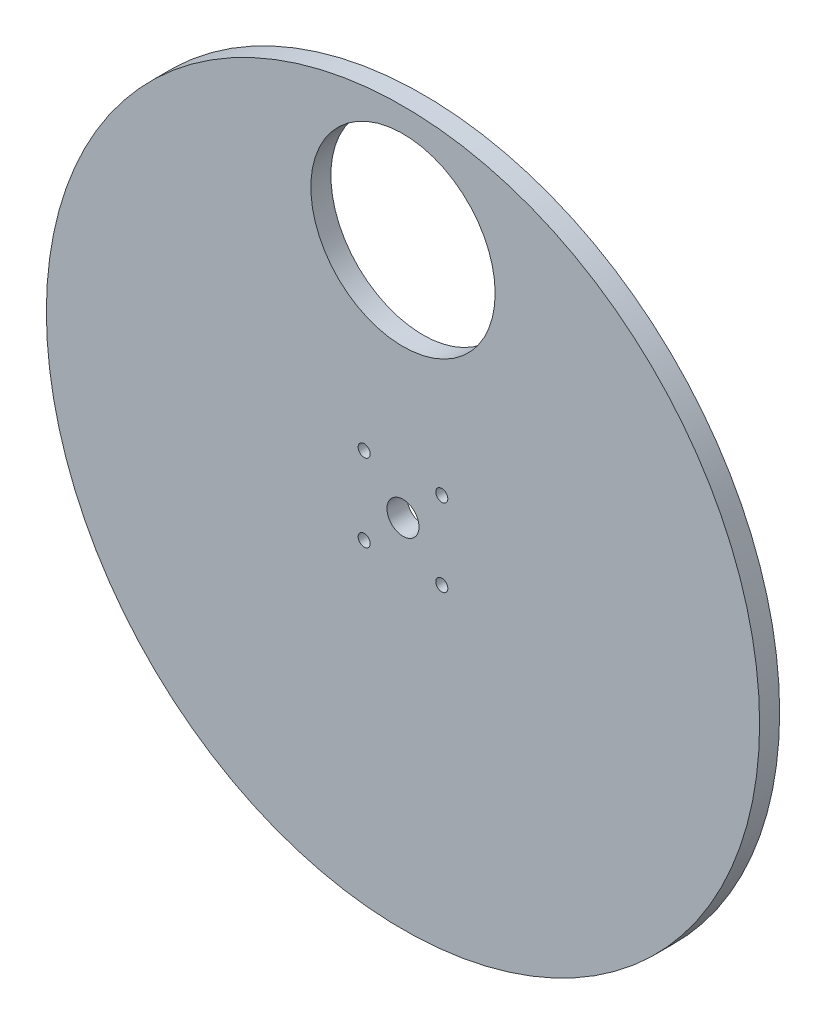
ISO-10303-21;
HEADER;
FILE_DESCRIPTION(('STEP AP214'),'2;1');
FILE_NAME('part.step','',(''),(''),'','','');
FILE_SCHEMA(('AUTOMOTIVE_DESIGN { 1 0 10303 214 1 1 1 1 }'));
ENDSEC;
DATA;
#1=APPLICATION_CONTEXT('core data for automotive mechanical design processes');
#2=APPLICATION_PROTOCOL_DEFINITION('international standard','automotive_design',2000,#1);
#3=PRODUCT_CONTEXT('',#1,'mechanical');
#4=PRODUCT('Part','Part','',(#3));
#5=PRODUCT_RELATED_PRODUCT_CATEGORY('part','',(#4));
#6=PRODUCT_DEFINITION_FORMATION('','',#4);
#7=PRODUCT_DEFINITION_CONTEXT('part definition',#1,'design');
#8=PRODUCT_DEFINITION('design','',#6,#7);
#9=PRODUCT_DEFINITION_SHAPE('','',#8);
#10=(LENGTH_UNIT() NAMED_UNIT(*) SI_UNIT(.MILLI.,.METRE.));
#11=(NAMED_UNIT(*) PLANE_ANGLE_UNIT() SI_UNIT($,.RADIAN.));
#12=(NAMED_UNIT(*) SI_UNIT($,.STERADIAN.) SOLID_ANGLE_UNIT());
#13=UNCERTAINTY_MEASURE_WITH_UNIT(LENGTH_MEASURE(1.E-05),#10,'distance_accuracy_value','');
#14=(GEOMETRIC_REPRESENTATION_CONTEXT(3) GLOBAL_UNCERTAINTY_ASSIGNED_CONTEXT((#13)) GLOBAL_UNIT_ASSIGNED_CONTEXT((#10,
#11,#12)) REPRESENTATION_CONTEXT('',''));
#15=CARTESIAN_POINT('',(0.,0.,0.));
#16=DIRECTION('',(0.,0.,1.));
#17=DIRECTION('',(1.,0.,0.));
#18=AXIS2_PLACEMENT_3D('',#15,#16,#17);
#19=CARTESIAN_POINT('',(0.,0.,5.));
#20=DIRECTION('',(0.,0.,1.));
#21=DIRECTION('',(1.,0.,0.));
#22=AXIS2_PLACEMENT_3D('',#19,#20,#21);
#23=PLANE('',#22);
#24=CARTESIAN_POINT('',(9.68620346185681,-9.68620346185671,5.));
#25=DIRECTION('',(0.,0.,1.));
#26=DIRECTION('',(1.,0.,0.));
#27=AXIS2_PLACEMENT_3D('',#24,#25,#26);
#28=CIRCLE('',#27,1.49999999999999);
#29=CARTESIAN_POINT('',(11.1862034618568,-9.68620346185671,5.));
#30=VERTEX_POINT('',#29);
#31=EDGE_CURVE('E65',#30,#30,#28,.T.);
#32=ORIENTED_EDGE('',*,*,#31,.F.);
#33=EDGE_LOOP('',(#32));
#34=FACE_BOUND('',#33,.T.);
#35=CARTESIAN_POINT('',(0.,60.,5.));
#36=DIRECTION('',(0.,0.,1.));
#37=DIRECTION('',(1.,0.,0.));
#38=AXIS2_PLACEMENT_3D('',#35,#36,#37);
#39=CIRCLE('',#38,23.);
#40=CARTESIAN_POINT('',(23.,60.,5.));
#41=VERTEX_POINT('',#40);
#42=EDGE_CURVE('E53',#41,#41,#39,.T.);
#43=ORIENTED_EDGE('',*,*,#42,.F.);
#44=EDGE_LOOP('',(#43));
#45=FACE_BOUND('',#44,.T.);
#46=CARTESIAN_POINT('',(0.,0.,5.));
#47=DIRECTION('',(0.,0.,1.));
#48=DIRECTION('',(1.,0.,0.));
#49=AXIS2_PLACEMENT_3D('',#46,#47,#48);
#50=CIRCLE('',#49,4.);
#51=CARTESIAN_POINT('',(4.,0.,5.));
#52=VERTEX_POINT('',#51);
#53=EDGE_CURVE('E42',#52,#52,#50,.T.);
#54=ORIENTED_EDGE('',*,*,#53,.F.);
#55=EDGE_LOOP('',(#54));
#56=FACE_BOUND('',#55,.T.);
#57=CARTESIAN_POINT('',(0.,0.,5.));
#58=DIRECTION('',(0.,0.,1.));
#59=DIRECTION('',(1.,0.,0.));
#60=AXIS2_PLACEMENT_3D('',#57,#58,#59);
#61=CIRCLE('',#60,89.);
#62=CARTESIAN_POINT('',(89.,0.,5.));
#63=VERTEX_POINT('',#62);
#64=EDGE_CURVE('E10',#63,#63,#61,.T.);
#65=ORIENTED_EDGE('',*,*,#64,.T.);
#66=EDGE_LOOP('',(#65));
#67=FACE_BOUND('',#66,.T.);
#68=CARTESIAN_POINT('',(-9.68620346185681,9.68620346185671,5.));
#69=DIRECTION('',(0.,0.,1.));
#70=DIRECTION('',(1.,0.,0.));
#71=AXIS2_PLACEMENT_3D('',#68,#69,#70);
#72=CIRCLE('',#71,1.5);
#73=CARTESIAN_POINT('',(-8.18620346185681,9.68620346185671,5.));
#74=VERTEX_POINT('',#73);
#75=EDGE_CURVE('E47',#74,#74,#72,.T.);
#76=ORIENTED_EDGE('',*,*,#75,.F.);
#77=EDGE_LOOP('',(#76));
#78=FACE_BOUND('',#77,.T.);
#79=CARTESIAN_POINT('',(9.68620346185681,9.68620346185671,5.));
#80=DIRECTION('',(0.,0.,1.));
#81=DIRECTION('',(1.,0.,0.));
#82=AXIS2_PLACEMENT_3D('',#79,#80,#81);
#83=CIRCLE('',#82,1.5);
#84=CARTESIAN_POINT('',(11.1862034618568,9.68620346185671,5.));
#85=VERTEX_POINT('',#84);
#86=EDGE_CURVE('E59',#85,#85,#83,.T.);
#87=ORIENTED_EDGE('',*,*,#86,.F.);
#88=EDGE_LOOP('',(#87));
#89=FACE_BOUND('',#88,.T.);
#90=CARTESIAN_POINT('',(-9.68620346185681,-9.68620346185671,5.));
#91=DIRECTION('',(0.,0.,1.));
#92=DIRECTION('',(1.,0.,0.));
#93=AXIS2_PLACEMENT_3D('',#90,#91,#92);
#94=CIRCLE('',#93,1.5);
#95=CARTESIAN_POINT('',(-8.18620346185681,-9.68620346185671,5.));
#96=VERTEX_POINT('',#95);
#97=EDGE_CURVE('E71',#96,#96,#94,.T.);
#98=ORIENTED_EDGE('',*,*,#97,.F.);
#99=EDGE_LOOP('',(#98));
#100=FACE_BOUND('',#99,.T.);
#101=ADVANCED_FACE('F31',(#34,#45,#56,#67,#78,#89,#100),#23,.T.);
#102=CARTESIAN_POINT('',(0.,0.,0.));
#103=DIRECTION('',(0.,0.,1.));
#104=DIRECTION('',(1.,0.,0.));
#105=AXIS2_PLACEMENT_3D('',#102,#103,#104);
#106=PLANE('',#105);
#107=CARTESIAN_POINT('',(0.,0.,0.));
#108=DIRECTION('',(0.,0.,1.));
#109=DIRECTION('',(1.,0.,0.));
#110=AXIS2_PLACEMENT_3D('',#107,#108,#109);
#111=CIRCLE('',#110,89.);
#112=CARTESIAN_POINT('',(89.,0.,0.));
#113=VERTEX_POINT('',#112);
#114=EDGE_CURVE('E35',#113,#113,#111,.T.);
#115=ORIENTED_EDGE('',*,*,#114,.F.);
#116=EDGE_LOOP('',(#115));
#117=FACE_BOUND('',#116,.T.);
#118=CARTESIAN_POINT('',(0.,0.,0.));
#119=DIRECTION('',(0.,0.,1.));
#120=DIRECTION('',(1.,0.,0.));
#121=AXIS2_PLACEMENT_3D('',#118,#119,#120);
#122=CIRCLE('',#121,4.);
#123=CARTESIAN_POINT('',(4.,0.,0.));
#124=VERTEX_POINT('',#123);
#125=EDGE_CURVE('E44',#124,#124,#122,.T.);
#126=ORIENTED_EDGE('',*,*,#125,.T.);
#127=EDGE_LOOP('',(#126));
#128=FACE_BOUND('',#127,.T.);
#129=CARTESIAN_POINT('',(-9.68620346185681,9.68620346185671,0.));
#130=DIRECTION('',(0.,0.,1.));
#131=DIRECTION('',(1.,0.,0.));
#132=AXIS2_PLACEMENT_3D('',#129,#130,#131);
#133=CIRCLE('',#132,1.5);
#134=CARTESIAN_POINT('',(-8.18620346185681,9.68620346185671,0.));
#135=VERTEX_POINT('',#134);
#136=EDGE_CURVE('E50',#135,#135,#133,.T.);
#137=ORIENTED_EDGE('',*,*,#136,.T.);
#138=EDGE_LOOP('',(#137));
#139=FACE_BOUND('',#138,.T.);
#140=CARTESIAN_POINT('',(0.,60.,0.));
#141=DIRECTION('',(0.,0.,1.));
#142=DIRECTION('',(1.,0.,0.));
#143=AXIS2_PLACEMENT_3D('',#140,#141,#142);
#144=CIRCLE('',#143,23.);
#145=CARTESIAN_POINT('',(23.,60.,0.));
#146=VERTEX_POINT('',#145);
#147=EDGE_CURVE('E56',#146,#146,#144,.T.);
#148=ORIENTED_EDGE('',*,*,#147,.T.);
#149=EDGE_LOOP('',(#148));
#150=FACE_BOUND('',#149,.T.);
#151=CARTESIAN_POINT('',(9.68620346185681,9.68620346185671,0.));
#152=DIRECTION('',(0.,0.,1.));
#153=DIRECTION('',(1.,0.,0.));
#154=AXIS2_PLACEMENT_3D('',#151,#152,#153);
#155=CIRCLE('',#154,1.5);
#156=CARTESIAN_POINT('',(11.1862034618568,9.68620346185671,0.));
#157=VERTEX_POINT('',#156);
#158=EDGE_CURVE('E62',#157,#157,#155,.T.);
#159=ORIENTED_EDGE('',*,*,#158,.T.);
#160=EDGE_LOOP('',(#159));
#161=FACE_BOUND('',#160,.T.);
#162=CARTESIAN_POINT('',(9.68620346185681,-9.68620346185671,0.));
#163=DIRECTION('',(0.,0.,1.));
#164=DIRECTION('',(1.,0.,0.));
#165=AXIS2_PLACEMENT_3D('',#162,#163,#164);
#166=CIRCLE('',#165,1.49999999999999);
#167=CARTESIAN_POINT('',(11.1862034618568,-9.68620346185671,0.));
#168=VERTEX_POINT('',#167);
#169=EDGE_CURVE('E68',#168,#168,#166,.T.);
#170=ORIENTED_EDGE('',*,*,#169,.T.);
#171=EDGE_LOOP('',(#170));
#172=FACE_BOUND('',#171,.T.);
#173=CARTESIAN_POINT('',(-9.68620346185681,-9.68620346185671,0.));
#174=DIRECTION('',(0.,0.,1.));
#175=DIRECTION('',(1.,0.,0.));
#176=AXIS2_PLACEMENT_3D('',#173,#174,#175);
#177=CIRCLE('',#176,1.5);
#178=CARTESIAN_POINT('',(-8.18620346185681,-9.68620346185671,0.));
#179=VERTEX_POINT('',#178);
#180=EDGE_CURVE('E74',#179,#179,#177,.T.);
#181=ORIENTED_EDGE('',*,*,#180,.T.);
#182=EDGE_LOOP('',(#181));
#183=FACE_BOUND('',#182,.T.);
#184=ADVANCED_FACE('F84',(#117,#128,#139,#150,#161,#172,#183),#106,.F.);
#185=CARTESIAN_POINT('',(0.,0.,5.));
#186=DIRECTION('',(0.,0.,-1.));
#187=DIRECTION('',(-1.,0.,0.));
#188=AXIS2_PLACEMENT_3D('',#185,#186,#187);
#189=CYLINDRICAL_SURFACE('',#188,89.);
#190=ORIENTED_EDGE('',*,*,#64,.F.);
#191=EDGE_LOOP('',(#190));
#192=FACE_BOUND('',#191,.T.);
#193=ORIENTED_EDGE('',*,*,#114,.T.);
#194=EDGE_LOOP('',(#193));
#195=FACE_BOUND('',#194,.T.);
#196=ADVANCED_FACE('F33',(#192,#195),#189,.T.);
#197=CARTESIAN_POINT('',(0.,0.,5.));
#198=DIRECTION('',(0.,0.,-1.));
#199=DIRECTION('',(-1.,0.,0.));
#200=AXIS2_PLACEMENT_3D('',#197,#198,#199);
#201=CYLINDRICAL_SURFACE('',#200,4.);
#202=ORIENTED_EDGE('',*,*,#53,.T.);
#203=EDGE_LOOP('',(#202));
#204=FACE_BOUND('',#203,.T.);
#205=ORIENTED_EDGE('',*,*,#125,.F.);
#206=EDGE_LOOP('',(#205));
#207=FACE_BOUND('',#206,.T.);
#208=ADVANCED_FACE('F94',(#204,#207),#201,.F.);
#209=CARTESIAN_POINT('',(-9.68620346185681,9.68620346185671,5.));
#210=DIRECTION('',(0.,0.,-1.));
#211=DIRECTION('',(-1.,0.,0.));
#212=AXIS2_PLACEMENT_3D('',#209,#210,#211);
#213=CYLINDRICAL_SURFACE('',#212,1.5);
#214=ORIENTED_EDGE('',*,*,#75,.T.);
#215=EDGE_LOOP('',(#214));
#216=FACE_BOUND('',#215,.T.);
#217=ORIENTED_EDGE('',*,*,#136,.F.);
#218=EDGE_LOOP('',(#217));
#219=FACE_BOUND('',#218,.T.);
#220=ADVANCED_FACE('F97',(#216,#219),#213,.F.);
#221=CARTESIAN_POINT('',(0.,60.,5.));
#222=DIRECTION('',(0.,0.,-1.));
#223=DIRECTION('',(-1.,0.,0.));
#224=AXIS2_PLACEMENT_3D('',#221,#222,#223);
#225=CYLINDRICAL_SURFACE('',#224,23.);
#226=ORIENTED_EDGE('',*,*,#42,.T.);
#227=EDGE_LOOP('',(#226));
#228=FACE_BOUND('',#227,.T.);
#229=ORIENTED_EDGE('',*,*,#147,.F.);
#230=EDGE_LOOP('',(#229));
#231=FACE_BOUND('',#230,.T.);
#232=ADVANCED_FACE('F101',(#228,#231),#225,.F.);
#233=CARTESIAN_POINT('',(9.68620346185681,9.68620346185671,5.));
#234=DIRECTION('',(0.,0.,-1.));
#235=DIRECTION('',(-1.,0.,0.));
#236=AXIS2_PLACEMENT_3D('',#233,#234,#235);
#237=CYLINDRICAL_SURFACE('',#236,1.5);
#238=ORIENTED_EDGE('',*,*,#86,.T.);
#239=EDGE_LOOP('',(#238));
#240=FACE_BOUND('',#239,.T.);
#241=ORIENTED_EDGE('',*,*,#158,.F.);
#242=EDGE_LOOP('',(#241));
#243=FACE_BOUND('',#242,.T.);
#244=ADVANCED_FACE('F105',(#240,#243),#237,.F.);
#245=CARTESIAN_POINT('',(9.68620346185681,-9.68620346185671,5.));
#246=DIRECTION('',(0.,0.,-1.));
#247=DIRECTION('',(-1.,0.,0.));
#248=AXIS2_PLACEMENT_3D('',#245,#246,#247);
#249=CYLINDRICAL_SURFACE('',#248,1.49999999999999);
#250=ORIENTED_EDGE('',*,*,#31,.T.);
#251=EDGE_LOOP('',(#250));
#252=FACE_BOUND('',#251,.T.);
#253=ORIENTED_EDGE('',*,*,#169,.F.);
#254=EDGE_LOOP('',(#253));
#255=FACE_BOUND('',#254,.T.);
#256=ADVANCED_FACE('F109',(#252,#255),#249,.F.);
#257=CARTESIAN_POINT('',(-9.68620346185681,-9.68620346185671,5.));
#258=DIRECTION('',(0.,0.,-1.));
#259=DIRECTION('',(-1.,0.,0.));
#260=AXIS2_PLACEMENT_3D('',#257,#258,#259);
#261=CYLINDRICAL_SURFACE('',#260,1.5);
#262=ORIENTED_EDGE('',*,*,#97,.T.);
#263=EDGE_LOOP('',(#262));
#264=FACE_BOUND('',#263,.T.);
#265=ORIENTED_EDGE('',*,*,#180,.F.);
#266=EDGE_LOOP('',(#265));
#267=FACE_BOUND('',#266,.T.);
#268=ADVANCED_FACE('F80',(#264,#267),#261,.F.);
#269=CLOSED_SHELL('',(#101,#184,#196,#208,#220,#232,#244,#256,#268));
#270=MANIFOLD_SOLID_BREP('B2',#269);
#271=ADVANCED_BREP_SHAPE_REPRESENTATION('',(#18,#270),#14);
#272=SHAPE_DEFINITION_REPRESENTATION(#9,#271);
ENDSEC;
END-ISO-10303-21;
